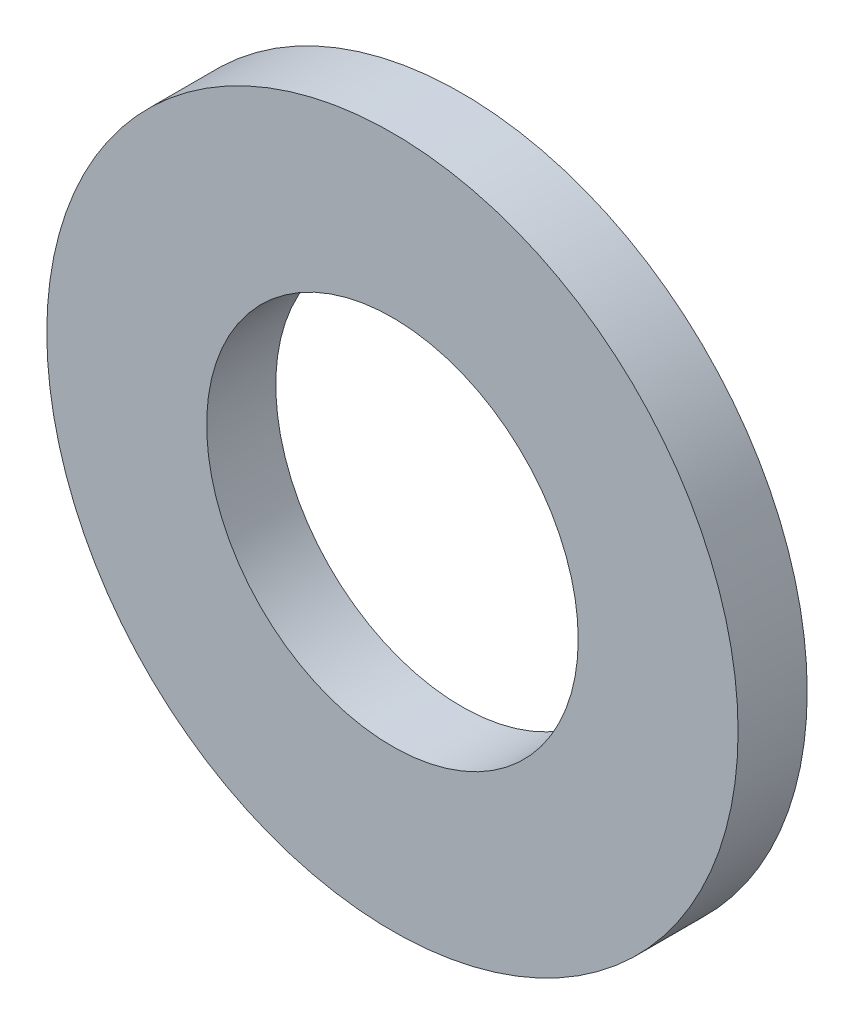
ISO-10303-21;
HEADER;
FILE_DESCRIPTION(('STEP AP214'),'2;1');
FILE_NAME('part.step','',(''),(''),'','','');
FILE_SCHEMA(('AUTOMOTIVE_DESIGN { 1 0 10303 214 1 1 1 1 }'));
ENDSEC;
DATA;
#1=APPLICATION_CONTEXT('core data for automotive mechanical design processes');
#2=APPLICATION_PROTOCOL_DEFINITION('international standard','automotive_design',2000,#1);
#3=PRODUCT_CONTEXT('',#1,'mechanical');
#4=PRODUCT('Part','Part','',(#3));
#5=PRODUCT_RELATED_PRODUCT_CATEGORY('part','',(#4));
#6=PRODUCT_DEFINITION_FORMATION('','',#4);
#7=PRODUCT_DEFINITION_CONTEXT('part definition',#1,'design');
#8=PRODUCT_DEFINITION('design','',#6,#7);
#9=PRODUCT_DEFINITION_SHAPE('','',#8);
#10=(LENGTH_UNIT() NAMED_UNIT(*) SI_UNIT(.MILLI.,.METRE.));
#11=(NAMED_UNIT(*) PLANE_ANGLE_UNIT() SI_UNIT($,.RADIAN.));
#12=(NAMED_UNIT(*) SI_UNIT($,.STERADIAN.) SOLID_ANGLE_UNIT());
#13=UNCERTAINTY_MEASURE_WITH_UNIT(LENGTH_MEASURE(1.E-05),#10,'distance_accuracy_value','');
#14=(GEOMETRIC_REPRESENTATION_CONTEXT(3) GLOBAL_UNCERTAINTY_ASSIGNED_CONTEXT((#13)) GLOBAL_UNIT_ASSIGNED_CONTEXT((#10,
#11,#12)) REPRESENTATION_CONTEXT('',''));
#15=CARTESIAN_POINT('',(0.,0.,0.));
#16=DIRECTION('',(0.,0.,1.));
#17=DIRECTION('',(1.,0.,0.));
#18=AXIS2_PLACEMENT_3D('',#15,#16,#17);
#19=CARTESIAN_POINT('',(0.,0.,0.));
#20=DIRECTION('',(0.,0.,1.));
#21=DIRECTION('',(1.,0.,0.));
#22=AXIS2_PLACEMENT_3D('',#19,#20,#21);
#23=CYLINDRICAL_SURFACE('',#22,4.3);
#24=DIRECTION('',(0.,0.,1.));
#25=VECTOR('',#24,1.);
#26=CARTESIAN_POINT('',(4.3,0.,0.));
#27=LINE('',#26,#25);
#28=CARTESIAN_POINT('',(4.3,0.,0.));
#29=VERTEX_POINT('',#28);
#30=CARTESIAN_POINT('',(4.3,0.,1.6));
#31=VERTEX_POINT('',#30);
#32=EDGE_CURVE('E9',#29,#31,#27,.T.);
#33=ORIENTED_EDGE('',*,*,#32,.F.);
#34=CARTESIAN_POINT('',(0.,0.,0.));
#35=DIRECTION('',(0.,0.,1.));
#36=DIRECTION('',(1.,0.,0.));
#37=AXIS2_PLACEMENT_3D('',#34,#35,#36);
#38=CIRCLE('',#37,4.3);
#39=EDGE_CURVE('E24',#29,#29,#38,.T.);
#40=ORIENTED_EDGE('',*,*,#39,.F.);
#41=ORIENTED_EDGE('',*,*,#32,.T.);
#42=CARTESIAN_POINT('',(0.,0.,1.6));
#43=DIRECTION('',(0.,0.,1.));
#44=DIRECTION('',(1.,0.,0.));
#45=AXIS2_PLACEMENT_3D('',#42,#43,#44);
#46=CIRCLE('',#45,4.3);
#47=EDGE_CURVE('E65',#31,#31,#46,.T.);
#48=ORIENTED_EDGE('',*,*,#47,.T.);
#49=EDGE_LOOP('',(#33,#40,#41,#48));
#50=FACE_BOUND('',#49,.T.);
#51=ADVANCED_FACE('F15',(#50),#23,.F.);
#52=CARTESIAN_POINT('',(0.,0.,0.));
#53=DIRECTION('',(0.,0.,1.));
#54=DIRECTION('',(1.,0.,0.));
#55=AXIS2_PLACEMENT_3D('',#52,#53,#54);
#56=PLANE('',#55);
#57=ORIENTED_EDGE('',*,*,#39,.T.);
#58=EDGE_LOOP('',(#57));
#59=FACE_BOUND('',#58,.T.);
#60=CARTESIAN_POINT('',(0.,0.,0.));
#61=DIRECTION('',(0.,0.,1.));
#62=DIRECTION('',(1.,0.,0.));
#63=AXIS2_PLACEMENT_3D('',#60,#61,#62);
#64=CIRCLE('',#63,8.);
#65=CARTESIAN_POINT('',(8.,0.,0.));
#66=VERTEX_POINT('',#65);
#67=EDGE_CURVE('E54',#66,#66,#64,.T.);
#68=ORIENTED_EDGE('',*,*,#67,.F.);
#69=EDGE_LOOP('',(#68));
#70=FACE_BOUND('',#69,.T.);
#71=ADVANCED_FACE('F17',(#59,#70),#56,.F.);
#72=CARTESIAN_POINT('',(0.,0.,1.6));
#73=DIRECTION('',(0.,0.,1.));
#74=DIRECTION('',(1.,0.,0.));
#75=AXIS2_PLACEMENT_3D('',#72,#73,#74);
#76=PLANE('',#75);
#77=ORIENTED_EDGE('',*,*,#47,.F.);
#78=EDGE_LOOP('',(#77));
#79=FACE_BOUND('',#78,.T.);
#80=CARTESIAN_POINT('',(0.,0.,1.6));
#81=DIRECTION('',(0.,0.,1.));
#82=DIRECTION('',(1.,0.,0.));
#83=AXIS2_PLACEMENT_3D('',#80,#81,#82);
#84=CIRCLE('',#83,8.);
#85=CARTESIAN_POINT('',(8.,0.,1.6));
#86=VERTEX_POINT('',#85);
#87=EDGE_CURVE('E52',#86,#86,#84,.T.);
#88=ORIENTED_EDGE('',*,*,#87,.T.);
#89=EDGE_LOOP('',(#88));
#90=FACE_BOUND('',#89,.T.);
#91=ADVANCED_FACE('F56',(#79,#90),#76,.T.);
#92=CARTESIAN_POINT('',(0.,0.,0.));
#93=DIRECTION('',(0.,0.,1.));
#94=DIRECTION('',(1.,0.,0.));
#95=AXIS2_PLACEMENT_3D('',#92,#93,#94);
#96=CYLINDRICAL_SURFACE('',#95,8.);
#97=ORIENTED_EDGE('',*,*,#87,.F.);
#98=DIRECTION('',(0.,0.,1.));
#99=VECTOR('',#98,1.);
#100=CARTESIAN_POINT('',(8.,0.,0.));
#101=LINE('',#100,#99);
#102=EDGE_CURVE('E49',#66,#86,#101,.T.);
#103=ORIENTED_EDGE('',*,*,#102,.F.);
#104=ORIENTED_EDGE('',*,*,#67,.T.);
#105=ORIENTED_EDGE('',*,*,#102,.T.);
#106=EDGE_LOOP('',(#97,#103,#104,#105));
#107=FACE_BOUND('',#106,.T.);
#108=ADVANCED_FACE('F55',(#107),#96,.T.);
#109=CLOSED_SHELL('',(#51,#71,#91,#108));
#110=MANIFOLD_SOLID_BREP('B1',#109);
#111=ADVANCED_BREP_SHAPE_REPRESENTATION('',(#18,#110),#14);
#112=SHAPE_DEFINITION_REPRESENTATION(#9,#111);
ENDSEC;
END-ISO-10303-21;
